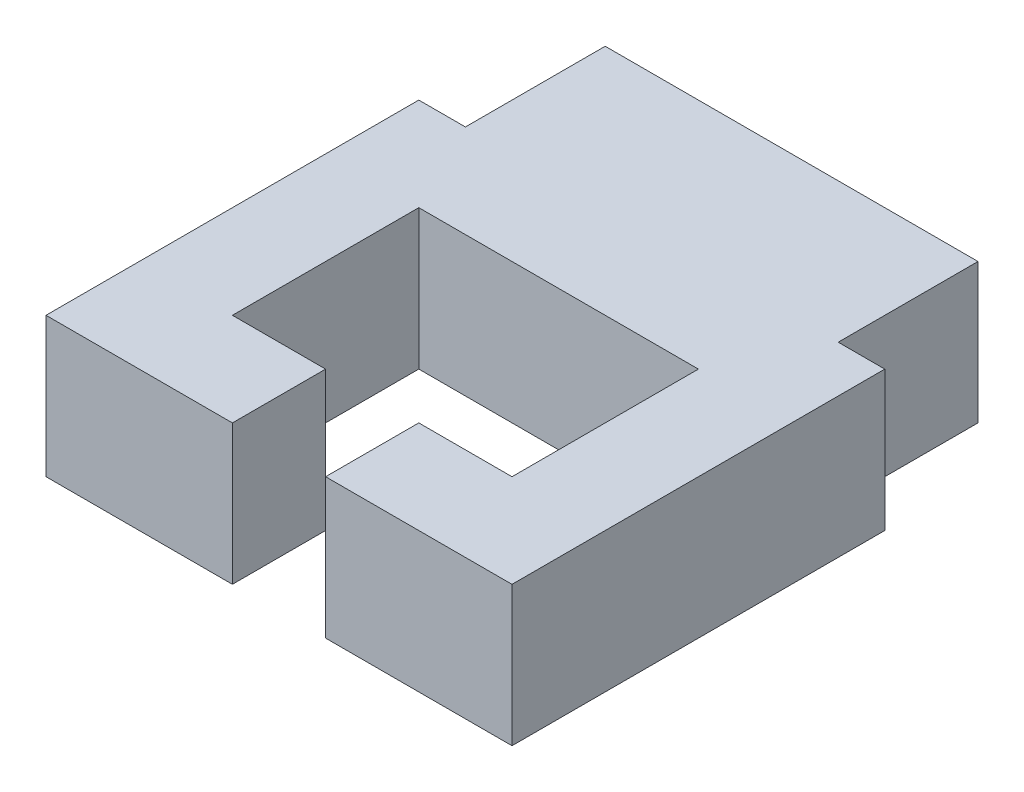
ISO-10303-21;
HEADER;
FILE_DESCRIPTION(('STEP AP214'),'2;1');
FILE_NAME('part.step','',(''),(''),'','','');
FILE_SCHEMA(('AUTOMOTIVE_DESIGN { 1 0 10303 214 1 1 1 1 }'));
ENDSEC;
DATA;
#1=APPLICATION_CONTEXT('core data for automotive mechanical design processes');
#2=APPLICATION_PROTOCOL_DEFINITION('international standard','automotive_design',2000,#1);
#3=PRODUCT_CONTEXT('',#1,'mechanical');
#4=PRODUCT('Part','Part','',(#3));
#5=PRODUCT_RELATED_PRODUCT_CATEGORY('part','',(#4));
#6=PRODUCT_DEFINITION_FORMATION('','',#4);
#7=PRODUCT_DEFINITION_CONTEXT('part definition',#1,'design');
#8=PRODUCT_DEFINITION('design','',#6,#7);
#9=PRODUCT_DEFINITION_SHAPE('','',#8);
#10=(LENGTH_UNIT() NAMED_UNIT(*) SI_UNIT(.MILLI.,.METRE.));
#11=(NAMED_UNIT(*) PLANE_ANGLE_UNIT() SI_UNIT($,.RADIAN.));
#12=(NAMED_UNIT(*) SI_UNIT($,.STERADIAN.) SOLID_ANGLE_UNIT());
#13=UNCERTAINTY_MEASURE_WITH_UNIT(LENGTH_MEASURE(1.E-05),#10,'distance_accuracy_value','');
#14=(GEOMETRIC_REPRESENTATION_CONTEXT(3) GLOBAL_UNCERTAINTY_ASSIGNED_CONTEXT((#13)) GLOBAL_UNIT_ASSIGNED_CONTEXT((#10,
#11,#12)) REPRESENTATION_CONTEXT('',''));
#15=CARTESIAN_POINT('',(0.,0.,0.));
#16=DIRECTION('',(0.,0.,1.));
#17=DIRECTION('',(1.,0.,0.));
#18=AXIS2_PLACEMENT_3D('',#15,#16,#17);
#19=CARTESIAN_POINT('',(-109.42360649,37.2151938321933,8.));
#20=DIRECTION('',(1.,0.,0.));
#21=DIRECTION('',(0.,0.,-1.));
#22=AXIS2_PLACEMENT_3D('',#19,#20,#21);
#23=PLANE('',#22);
#24=DIRECTION('',(0.,-1.,0.));
#25=VECTOR('',#24,1.);
#26=CARTESIAN_POINT('',(-109.42360649,37.2151938321933,6.));
#27=LINE('',#26,#25);
#28=CARTESIAN_POINT('',(-109.42360649,37.2151938321933,6.));
#29=VERTEX_POINT('',#28);
#30=CARTESIAN_POINT('',(-109.42360649,34.2151938321933,6.));
#31=VERTEX_POINT('',#30);
#32=EDGE_CURVE('E177',#29,#31,#27,.T.);
#33=ORIENTED_EDGE('',*,*,#32,.F.);
#34=DIRECTION('',(0.,0.,-1.));
#35=VECTOR('',#34,1.);
#36=CARTESIAN_POINT('',(-109.42360649,37.2151938321933,8.));
#37=LINE('',#36,#35);
#38=CARTESIAN_POINT('',(-109.42360649,37.2151938321933,2.));
#39=VERTEX_POINT('',#38);
#40=EDGE_CURVE('E222',#29,#39,#37,.T.);
#41=ORIENTED_EDGE('',*,*,#40,.T.);
#42=DIRECTION('',(0.,-1.,0.));
#43=VECTOR('',#42,1.);
#44=CARTESIAN_POINT('',(-109.42360649,37.2151938321933,2.));
#45=LINE('',#44,#43);
#46=CARTESIAN_POINT('',(-109.42360649,34.2151938321933,2.));
#47=VERTEX_POINT('',#46);
#48=EDGE_CURVE('E215',#39,#47,#45,.T.);
#49=ORIENTED_EDGE('',*,*,#48,.T.);
#50=DIRECTION('',(0.,0.,-1.));
#51=VECTOR('',#50,1.);
#52=CARTESIAN_POINT('',(-109.42360649,34.2151938321933,8.));
#53=LINE('',#52,#51);
#54=EDGE_CURVE('E218',#31,#47,#53,.T.);
#55=ORIENTED_EDGE('',*,*,#54,.F.);
#56=EDGE_LOOP('',(#33,#41,#49,#55));
#57=FACE_BOUND('',#56,.T.);
#58=ADVANCED_FACE('F34',(#57),#23,.F.);
#59=CARTESIAN_POINT('',(-115.42360649,37.2151938321933,8.));
#60=DIRECTION('',(-1.,0.,0.));
#61=DIRECTION('',(0.,0.,1.));
#62=AXIS2_PLACEMENT_3D('',#59,#60,#61);
#63=PLANE('',#62);
#64=DIRECTION('',(0.,1.,0.));
#65=VECTOR('',#64,1.);
#66=CARTESIAN_POINT('',(-115.42360649,37.2151938321933,6.));
#67=LINE('',#66,#65);
#68=CARTESIAN_POINT('',(-115.42360649,34.2151938321933,6.));
#69=VERTEX_POINT('',#68);
#70=CARTESIAN_POINT('',(-115.42360649,37.2151938321933,6.));
#71=VERTEX_POINT('',#70);
#72=EDGE_CURVE('E187',#69,#71,#67,.T.);
#73=ORIENTED_EDGE('',*,*,#72,.F.);
#74=DIRECTION('',(0.,0.,-1.));
#75=VECTOR('',#74,1.);
#76=CARTESIAN_POINT('',(-115.42360649,34.2151938321933,8.));
#77=LINE('',#76,#75);
#78=CARTESIAN_POINT('',(-115.42360649,34.2151938321933,2.));
#79=VERTEX_POINT('',#78);
#80=EDGE_CURVE('E49',#69,#79,#77,.T.);
#81=ORIENTED_EDGE('',*,*,#80,.T.);
#82=DIRECTION('',(0.,1.,0.));
#83=VECTOR('',#82,1.);
#84=CARTESIAN_POINT('',(-115.42360649,37.2151938321933,2.));
#85=LINE('',#84,#83);
#86=CARTESIAN_POINT('',(-115.42360649,37.2151938321933,2.));
#87=VERTEX_POINT('',#86);
#88=EDGE_CURVE('E203',#79,#87,#85,.T.);
#89=ORIENTED_EDGE('',*,*,#88,.T.);
#90=DIRECTION('',(0.,0.,-1.));
#91=VECTOR('',#90,1.);
#92=CARTESIAN_POINT('',(-115.42360649,37.2151938321933,8.));
#93=LINE('',#92,#91);
#94=EDGE_CURVE('E57',#71,#87,#93,.T.);
#95=ORIENTED_EDGE('',*,*,#94,.F.);
#96=EDGE_LOOP('',(#73,#81,#89,#95));
#97=FACE_BOUND('',#96,.T.);
#98=ADVANCED_FACE('F312',(#97),#63,.F.);
#99=CARTESIAN_POINT('',(0.,0.,2.));
#100=DIRECTION('',(0.,0.,1.));
#101=DIRECTION('',(1.,0.,0.));
#102=AXIS2_PLACEMENT_3D('',#99,#100,#101);
#103=PLANE('',#102);
#104=DIRECTION('',(-1.,0.,0.));
#105=VECTOR('',#104,1.);
#106=CARTESIAN_POINT('',(-117.42360649,37.2151938321933,2.));
#107=LINE('',#106,#105);
#108=EDGE_CURVE('E252',#39,#87,#107,.T.);
#109=ORIENTED_EDGE('',*,*,#108,.T.);
#110=ORIENTED_EDGE('',*,*,#88,.F.);
#111=DIRECTION('',(1.,0.,0.));
#112=VECTOR('',#111,1.);
#113=CARTESIAN_POINT('',(-117.42360649,34.2151938321933,2.));
#114=LINE('',#113,#112);
#115=EDGE_CURVE('E249',#79,#47,#114,.T.);
#116=ORIENTED_EDGE('',*,*,#115,.T.);
#117=ORIENTED_EDGE('',*,*,#48,.F.);
#118=EDGE_LOOP('',(#109,#110,#116,#117));
#119=FACE_BOUND('',#118,.T.);
#120=ADVANCED_FACE('F315',(#119),#103,.T.);
#121=CARTESIAN_POINT('',(0.,0.,0.));
#122=DIRECTION('',(0.,0.,1.));
#123=DIRECTION('',(1.,0.,0.));
#124=AXIS2_PLACEMENT_3D('',#121,#122,#123);
#125=PLANE('',#124);
#126=DIRECTION('',(-1.,0.,0.));
#127=VECTOR('',#126,1.);
#128=CARTESIAN_POINT('',(-117.42360649,37.2151938321933,0.));
#129=LINE('',#128,#127);
#130=CARTESIAN_POINT('',(-116.423606490072,37.2151938321933,0.));
#131=VERTEX_POINT('',#130);
#132=CARTESIAN_POINT('',(-117.42360649,37.2151938321933,0.));
#133=VERTEX_POINT('',#132);
#134=EDGE_CURVE('E264',#131,#133,#129,.T.);
#135=ORIENTED_EDGE('',*,*,#134,.F.);
#136=DIRECTION('',(0.,-1.,0.));
#137=VECTOR('',#136,1.);
#138=CARTESIAN_POINT('',(-116.423606490072,0.,0.));
#139=LINE('',#138,#137);
#140=CARTESIAN_POINT('',(-116.423606490072,34.2151938321933,0.));
#141=VERTEX_POINT('',#140);
#142=EDGE_CURVE('E228',#131,#141,#139,.T.);
#143=ORIENTED_EDGE('',*,*,#142,.T.);
#144=DIRECTION('',(1.,0.,0.));
#145=VECTOR('',#144,1.);
#146=CARTESIAN_POINT('',(-117.42360649,34.2151938321933,0.));
#147=LINE('',#146,#145);
#148=CARTESIAN_POINT('',(-117.42360649,34.2151938321933,0.));
#149=VERTEX_POINT('',#148);
#150=EDGE_CURVE('E259',#149,#141,#147,.T.);
#151=ORIENTED_EDGE('',*,*,#150,.F.);
#152=DIRECTION('',(0.,-1.,0.));
#153=VECTOR('',#152,1.);
#154=CARTESIAN_POINT('',(-117.42360649,37.2151938321933,0.));
#155=LINE('',#154,#153);
#156=EDGE_CURVE('E248',#133,#149,#155,.T.);
#157=ORIENTED_EDGE('',*,*,#156,.F.);
#158=EDGE_LOOP('',(#135,#143,#151,#157));
#159=FACE_BOUND('',#158,.T.);
#160=ADVANCED_FACE('F297',(#159),#125,.F.);
#161=CARTESIAN_POINT('',(-117.42360649,37.2151938321933,2.));
#162=DIRECTION('',(1.,0.,0.));
#163=DIRECTION('',(0.,0.,-1.));
#164=AXIS2_PLACEMENT_3D('',#161,#162,#163);
#165=PLANE('',#164);
#166=ORIENTED_EDGE('',*,*,#156,.T.);
#167=DIRECTION('',(0.,0.,-1.));
#168=VECTOR('',#167,1.);
#169=CARTESIAN_POINT('',(-117.42360649,34.2151938321933,2.));
#170=LINE('',#169,#168);
#171=CARTESIAN_POINT('',(-117.42360649,34.2151938321933,8.));
#172=VERTEX_POINT('',#171);
#173=EDGE_CURVE('E11',#172,#149,#170,.T.);
#174=ORIENTED_EDGE('',*,*,#173,.F.);
#175=DIRECTION('',(0.,-1.,0.));
#176=VECTOR('',#175,1.);
#177=CARTESIAN_POINT('',(-117.42360649,34.2151938321933,8.));
#178=LINE('',#177,#176);
#179=CARTESIAN_POINT('',(-117.42360649,37.2151938321933,8.));
#180=VERTEX_POINT('',#179);
#181=EDGE_CURVE('E204',#180,#172,#178,.T.);
#182=ORIENTED_EDGE('',*,*,#181,.F.);
#183=DIRECTION('',(0.,0.,-1.));
#184=VECTOR('',#183,1.);
#185=CARTESIAN_POINT('',(-117.42360649,37.2151938321933,2.));
#186=LINE('',#185,#184);
#187=EDGE_CURVE('E255',#180,#133,#186,.T.);
#188=ORIENTED_EDGE('',*,*,#187,.T.);
#189=EDGE_LOOP('',(#166,#174,#182,#188));
#190=FACE_BOUND('',#189,.T.);
#191=ADVANCED_FACE('F36',(#190),#165,.F.);
#192=CARTESIAN_POINT('',(-117.42360649,34.2151938321933,2.));
#193=DIRECTION('',(0.,1.,0.));
#194=DIRECTION('',(0.,0.,1.));
#195=AXIS2_PLACEMENT_3D('',#192,#193,#194);
#196=PLANE('',#195);
#197=ORIENTED_EDGE('',*,*,#150,.T.);
#198=DIRECTION('',(0.,0.,1.));
#199=VECTOR('',#198,1.);
#200=CARTESIAN_POINT('',(-116.423606490072,34.2151938321933,-3.));
#201=LINE('',#200,#199);
#202=CARTESIAN_POINT('',(-116.423606490072,34.2151938321933,-3.));
#203=VERTEX_POINT('',#202);
#204=EDGE_CURVE('E242',#203,#141,#201,.T.);
#205=ORIENTED_EDGE('',*,*,#204,.F.);
#206=DIRECTION('',(-1.,0.,0.));
#207=VECTOR('',#206,1.);
#208=CARTESIAN_POINT('',(0.,34.2151938321933,-3.));
#209=LINE('',#208,#207);
#210=CARTESIAN_POINT('',(-108.423606490072,34.2151938321933,-3.));
#211=VERTEX_POINT('',#210);
#212=EDGE_CURVE('E231',#211,#203,#209,.T.);
#213=ORIENTED_EDGE('',*,*,#212,.F.);
#214=DIRECTION('',(0.,0.,1.));
#215=VECTOR('',#214,1.);
#216=CARTESIAN_POINT('',(-108.423606490072,34.2151938321933,-3.));
#217=LINE('',#216,#215);
#218=CARTESIAN_POINT('',(-108.423606490072,34.2151938321933,0.));
#219=VERTEX_POINT('',#218);
#220=EDGE_CURVE('E244',#211,#219,#217,.T.);
#221=ORIENTED_EDGE('',*,*,#220,.T.);
#222=CARTESIAN_POINT('',(-107.42360649,34.2151938321933,0.));
#223=VERTEX_POINT('',#222);
#224=EDGE_CURVE('E258',#219,#223,#147,.T.);
#225=ORIENTED_EDGE('',*,*,#224,.T.);
#226=DIRECTION('',(0.,0.,-1.));
#227=VECTOR('',#226,1.);
#228=CARTESIAN_POINT('',(-107.42360649,34.2151938321933,2.));
#229=LINE('',#228,#227);
#230=CARTESIAN_POINT('',(-107.42360649,34.2151938321933,8.));
#231=VERTEX_POINT('',#230);
#232=EDGE_CURVE('E42',#231,#223,#229,.T.);
#233=ORIENTED_EDGE('',*,*,#232,.F.);
#234=DIRECTION('',(1.,0.,0.));
#235=VECTOR('',#234,1.);
#236=CARTESIAN_POINT('',(-109.42360649,34.2151938321933,8.));
#237=LINE('',#236,#235);
#238=CARTESIAN_POINT('',(-111.42360649,34.2151938321933,8.));
#239=VERTEX_POINT('',#238);
#240=EDGE_CURVE('E161',#239,#231,#237,.T.);
#241=ORIENTED_EDGE('',*,*,#240,.F.);
#242=DIRECTION('',(0.,0.,1.));
#243=VECTOR('',#242,1.);
#244=CARTESIAN_POINT('',(-111.42360649,34.2151938321933,8.));
#245=LINE('',#244,#243);
#246=CARTESIAN_POINT('',(-111.42360649,34.2151938321933,6.));
#247=VERTEX_POINT('',#246);
#248=EDGE_CURVE('E176',#247,#239,#245,.T.);
#249=ORIENTED_EDGE('',*,*,#248,.F.);
#250=DIRECTION('',(1.,0.,0.));
#251=VECTOR('',#250,1.);
#252=CARTESIAN_POINT('',(-111.42360649,34.2151938321933,6.));
#253=LINE('',#252,#251);
#254=EDGE_CURVE('E182',#247,#31,#253,.T.);
#255=ORIENTED_EDGE('',*,*,#254,.T.);
#256=ORIENTED_EDGE('',*,*,#54,.T.);
#257=ORIENTED_EDGE('',*,*,#115,.F.);
#258=ORIENTED_EDGE('',*,*,#80,.F.);
#259=DIRECTION('',(-1.,0.,0.));
#260=VECTOR('',#259,1.);
#261=CARTESIAN_POINT('',(-113.42360649,34.2151938321933,6.));
#262=LINE('',#261,#260);
#263=CARTESIAN_POINT('',(-113.42360649,34.2151938321933,6.));
#264=VERTEX_POINT('',#263);
#265=EDGE_CURVE('E201',#264,#69,#262,.T.);
#266=ORIENTED_EDGE('',*,*,#265,.F.);
#267=DIRECTION('',(0.,0.,-1.));
#268=VECTOR('',#267,1.);
#269=CARTESIAN_POINT('',(-113.42360649,34.2151938321933,6.));
#270=LINE('',#269,#268);
#271=CARTESIAN_POINT('',(-113.42360649,34.2151938321933,8.));
#272=VERTEX_POINT('',#271);
#273=EDGE_CURVE('E191',#272,#264,#270,.T.);
#274=ORIENTED_EDGE('',*,*,#273,.F.);
#275=DIRECTION('',(1.,0.,0.));
#276=VECTOR('',#275,1.);
#277=CARTESIAN_POINT('',(-115.42360649,34.2151938321933,8.));
#278=LINE('',#277,#276);
#279=EDGE_CURVE('E207',#172,#272,#278,.T.);
#280=ORIENTED_EDGE('',*,*,#279,.F.);
#281=ORIENTED_EDGE('',*,*,#173,.T.);
#282=EDGE_LOOP('',(#197,#205,#213,#221,#225,#233,#241,#249,#255,#256,#257,#258,#266,#274,#280,#281));
#283=FACE_BOUND('',#282,.T.);
#284=ADVANCED_FACE('F299',(#283),#196,.F.);
#285=CARTESIAN_POINT('',(-107.42360649,37.2151938321933,2.));
#286=DIRECTION('',(-1.,0.,0.));
#287=DIRECTION('',(0.,0.,1.));
#288=AXIS2_PLACEMENT_3D('',#285,#286,#287);
#289=PLANE('',#288);
#290=DIRECTION('',(0.,1.,0.));
#291=VECTOR('',#290,1.);
#292=CARTESIAN_POINT('',(-107.42360649,37.2151938321933,0.));
#293=LINE('',#292,#291);
#294=CARTESIAN_POINT('',(-107.42360649,37.2151938321933,0.));
#295=VERTEX_POINT('',#294);
#296=EDGE_CURVE('E262',#223,#295,#293,.T.);
#297=ORIENTED_EDGE('',*,*,#296,.T.);
#298=DIRECTION('',(0.,0.,-1.));
#299=VECTOR('',#298,1.);
#300=CARTESIAN_POINT('',(-107.42360649,37.2151938321933,2.));
#301=LINE('',#300,#299);
#302=CARTESIAN_POINT('',(-107.42360649,37.2151938321933,8.));
#303=VERTEX_POINT('',#302);
#304=EDGE_CURVE('E268',#303,#295,#301,.T.);
#305=ORIENTED_EDGE('',*,*,#304,.F.);
#306=DIRECTION('',(0.,1.,0.));
#307=VECTOR('',#306,1.);
#308=CARTESIAN_POINT('',(-107.42360649,34.2151938321933,8.));
#309=LINE('',#308,#307);
#310=EDGE_CURVE('E159',#231,#303,#309,.T.);
#311=ORIENTED_EDGE('',*,*,#310,.F.);
#312=ORIENTED_EDGE('',*,*,#232,.T.);
#313=EDGE_LOOP('',(#297,#305,#311,#312));
#314=FACE_BOUND('',#313,.T.);
#315=ADVANCED_FACE('F272',(#314),#289,.F.);
#316=CARTESIAN_POINT('',(-117.42360649,37.2151938321933,2.));
#317=DIRECTION('',(0.,-1.,0.));
#318=DIRECTION('',(0.,0.,-1.));
#319=AXIS2_PLACEMENT_3D('',#316,#317,#318);
#320=PLANE('',#319);
#321=CARTESIAN_POINT('',(-108.423606490072,37.2151938321933,0.));
#322=VERTEX_POINT('',#321);
#323=EDGE_CURVE('E253',#295,#322,#129,.T.);
#324=ORIENTED_EDGE('',*,*,#323,.T.);
#325=DIRECTION('',(0.,0.,1.));
#326=VECTOR('',#325,1.);
#327=CARTESIAN_POINT('',(-108.423606490072,37.2151938321933,-3.));
#328=LINE('',#327,#326);
#329=CARTESIAN_POINT('',(-108.423606490072,37.2151938321933,-3.));
#330=VERTEX_POINT('',#329);
#331=EDGE_CURVE('E246',#330,#322,#328,.T.);
#332=ORIENTED_EDGE('',*,*,#331,.F.);
#333=DIRECTION('',(1.,0.,0.));
#334=VECTOR('',#333,1.);
#335=CARTESIAN_POINT('',(0.,37.2151938321933,-3.));
#336=LINE('',#335,#334);
#337=CARTESIAN_POINT('',(-116.423606490072,37.2151938321933,-3.));
#338=VERTEX_POINT('',#337);
#339=EDGE_CURVE('E225',#338,#330,#336,.T.);
#340=ORIENTED_EDGE('',*,*,#339,.F.);
#341=DIRECTION('',(0.,0.,1.));
#342=VECTOR('',#341,1.);
#343=CARTESIAN_POINT('',(-116.423606490072,37.2151938321933,-3.));
#344=LINE('',#343,#342);
#345=EDGE_CURVE('E236',#338,#131,#344,.T.);
#346=ORIENTED_EDGE('',*,*,#345,.T.);
#347=ORIENTED_EDGE('',*,*,#134,.T.);
#348=ORIENTED_EDGE('',*,*,#187,.F.);
#349=DIRECTION('',(-1.,0.,0.));
#350=VECTOR('',#349,1.);
#351=CARTESIAN_POINT('',(-117.42360649,37.2151938321933,8.));
#352=LINE('',#351,#350);
#353=CARTESIAN_POINT('',(-113.42360649,37.2151938321933,8.));
#354=VERTEX_POINT('',#353);
#355=EDGE_CURVE('E209',#354,#180,#352,.T.);
#356=ORIENTED_EDGE('',*,*,#355,.F.);
#357=DIRECTION('',(0.,0.,1.));
#358=VECTOR('',#357,1.);
#359=CARTESIAN_POINT('',(-113.42360649,37.2151938321933,8.));
#360=LINE('',#359,#358);
#361=CARTESIAN_POINT('',(-113.42360649,37.2151938321933,6.));
#362=VERTEX_POINT('',#361);
#363=EDGE_CURVE('E195',#362,#354,#360,.T.);
#364=ORIENTED_EDGE('',*,*,#363,.F.);
#365=DIRECTION('',(-1.,0.,0.));
#366=VECTOR('',#365,1.);
#367=CARTESIAN_POINT('',(-113.42360649,37.2151938321933,6.));
#368=LINE('',#367,#366);
#369=EDGE_CURVE('E198',#362,#71,#368,.T.);
#370=ORIENTED_EDGE('',*,*,#369,.T.);
#371=ORIENTED_EDGE('',*,*,#94,.T.);
#372=ORIENTED_EDGE('',*,*,#108,.F.);
#373=ORIENTED_EDGE('',*,*,#40,.F.);
#374=DIRECTION('',(1.,0.,0.));
#375=VECTOR('',#374,1.);
#376=CARTESIAN_POINT('',(-111.42360649,37.2151938321933,6.));
#377=LINE('',#376,#375);
#378=CARTESIAN_POINT('',(-111.42360649,37.2151938321933,6.));
#379=VERTEX_POINT('',#378);
#380=EDGE_CURVE('E168',#379,#29,#377,.T.);
#381=ORIENTED_EDGE('',*,*,#380,.F.);
#382=DIRECTION('',(0.,0.,-1.));
#383=VECTOR('',#382,1.);
#384=CARTESIAN_POINT('',(-111.42360649,37.2151938321933,8.));
#385=LINE('',#384,#383);
#386=CARTESIAN_POINT('',(-111.42360649,37.2151938321933,8.));
#387=VERTEX_POINT('',#386);
#388=EDGE_CURVE('E164',#387,#379,#385,.T.);
#389=ORIENTED_EDGE('',*,*,#388,.F.);
#390=DIRECTION('',(-1.,0.,0.));
#391=VECTOR('',#390,1.);
#392=CARTESIAN_POINT('',(-107.42360649,37.2151938321933,8.));
#393=LINE('',#392,#391);
#394=EDGE_CURVE('E152',#303,#387,#393,.T.);
#395=ORIENTED_EDGE('',*,*,#394,.F.);
#396=ORIENTED_EDGE('',*,*,#304,.T.);
#397=EDGE_LOOP('',(#324,#332,#340,#346,#347,#348,#356,#364,#370,#371,#372,#373,#381,#389,#395,#396));
#398=FACE_BOUND('',#397,.T.);
#399=ADVANCED_FACE('F166',(#398),#320,.F.);
#400=ORIENTED_EDGE('',*,*,#224,.F.);
#401=DIRECTION('',(0.,1.,0.));
#402=VECTOR('',#401,1.);
#403=CARTESIAN_POINT('',(-108.423606490072,0.,0.));
#404=LINE('',#403,#402);
#405=EDGE_CURVE('E224',#219,#322,#404,.T.);
#406=ORIENTED_EDGE('',*,*,#405,.T.);
#407=ORIENTED_EDGE('',*,*,#323,.F.);
#408=ORIENTED_EDGE('',*,*,#296,.F.);
#409=EDGE_LOOP('',(#400,#406,#407,#408));
#410=FACE_BOUND('',#409,.T.);
#411=ADVANCED_FACE('F277',(#410),#125,.F.);
#412=CARTESIAN_POINT('',(-108.423606490072,0.,-3.));
#413=DIRECTION('',(1.,0.,0.));
#414=DIRECTION('',(0.,0.,-1.));
#415=AXIS2_PLACEMENT_3D('',#412,#413,#414);
#416=PLANE('',#415);
#417=ORIENTED_EDGE('',*,*,#405,.F.);
#418=ORIENTED_EDGE('',*,*,#220,.F.);
#419=DIRECTION('',(0.,1.,0.));
#420=VECTOR('',#419,1.);
#421=CARTESIAN_POINT('',(-108.423606490072,0.,-3.));
#422=LINE('',#421,#420);
#423=EDGE_CURVE('E227',#211,#330,#422,.T.);
#424=ORIENTED_EDGE('',*,*,#423,.T.);
#425=ORIENTED_EDGE('',*,*,#331,.T.);
#426=EDGE_LOOP('',(#417,#418,#424,#425));
#427=FACE_BOUND('',#426,.T.);
#428=ADVANCED_FACE('F284',(#427),#416,.T.);
#429=CARTESIAN_POINT('',(-116.423606490072,0.,-3.));
#430=DIRECTION('',(-1.,0.,0.));
#431=DIRECTION('',(0.,0.,1.));
#432=AXIS2_PLACEMENT_3D('',#429,#430,#431);
#433=PLANE('',#432);
#434=ORIENTED_EDGE('',*,*,#142,.F.);
#435=ORIENTED_EDGE('',*,*,#345,.F.);
#436=DIRECTION('',(0.,-1.,0.));
#437=VECTOR('',#436,1.);
#438=CARTESIAN_POINT('',(-116.423606490072,0.,-3.));
#439=LINE('',#438,#437);
#440=EDGE_CURVE('E233',#338,#203,#439,.T.);
#441=ORIENTED_EDGE('',*,*,#440,.T.);
#442=ORIENTED_EDGE('',*,*,#204,.T.);
#443=EDGE_LOOP('',(#434,#435,#441,#442));
#444=FACE_BOUND('',#443,.T.);
#445=ADVANCED_FACE('F291',(#444),#433,.T.);
#446=CARTESIAN_POINT('',(0.,0.,-3.));
#447=DIRECTION('',(0.,0.,-1.));
#448=DIRECTION('',(-1.,0.,0.));
#449=AXIS2_PLACEMENT_3D('',#446,#447,#448);
#450=PLANE('',#449);
#451=ORIENTED_EDGE('',*,*,#339,.T.);
#452=ORIENTED_EDGE('',*,*,#423,.F.);
#453=ORIENTED_EDGE('',*,*,#212,.T.);
#454=ORIENTED_EDGE('',*,*,#440,.F.);
#455=EDGE_LOOP('',(#451,#452,#453,#454));
#456=FACE_BOUND('',#455,.T.);
#457=ADVANCED_FACE('F287',(#456),#450,.T.);
#458=CARTESIAN_POINT('',(0.,0.,8.));
#459=DIRECTION('',(0.,0.,1.));
#460=DIRECTION('',(1.,0.,0.));
#461=AXIS2_PLACEMENT_3D('',#458,#459,#460);
#462=PLANE('',#461);
#463=ORIENTED_EDGE('',*,*,#310,.T.);
#464=ORIENTED_EDGE('',*,*,#394,.T.);
#465=DIRECTION('',(0.,1.,0.));
#466=VECTOR('',#465,1.);
#467=CARTESIAN_POINT('',(-111.42360649,37.2151938321933,8.));
#468=LINE('',#467,#466);
#469=EDGE_CURVE('E157',#239,#387,#468,.T.);
#470=ORIENTED_EDGE('',*,*,#469,.F.);
#471=ORIENTED_EDGE('',*,*,#240,.T.);
#472=EDGE_LOOP('',(#463,#464,#470,#471));
#473=FACE_BOUND('',#472,.T.);
#474=ADVANCED_FACE('F154',(#473),#462,.T.);
#475=CARTESIAN_POINT('',(0.,0.,8.));
#476=DIRECTION('',(0.,0.,-1.));
#477=DIRECTION('',(-1.,0.,0.));
#478=AXIS2_PLACEMENT_3D('',#475,#476,#477);
#479=PLANE('',#478);
#480=ORIENTED_EDGE('',*,*,#181,.T.);
#481=ORIENTED_EDGE('',*,*,#279,.T.);
#482=DIRECTION('',(0.,-1.,0.));
#483=VECTOR('',#482,1.);
#484=CARTESIAN_POINT('',(-113.42360649,34.2151938321933,8.));
#485=LINE('',#484,#483);
#486=EDGE_CURVE('E188',#354,#272,#485,.T.);
#487=ORIENTED_EDGE('',*,*,#486,.F.);
#488=ORIENTED_EDGE('',*,*,#355,.T.);
#489=EDGE_LOOP('',(#480,#481,#487,#488));
#490=FACE_BOUND('',#489,.T.);
#491=ADVANCED_FACE('F304',(#490),#479,.F.);
#492=CARTESIAN_POINT('',(-113.42360649,37.2151938321933,6.));
#493=DIRECTION('',(0.,0.,1.));
#494=DIRECTION('',(1.,0.,0.));
#495=AXIS2_PLACEMENT_3D('',#492,#493,#494);
#496=PLANE('',#495);
#497=ORIENTED_EDGE('',*,*,#72,.T.);
#498=ORIENTED_EDGE('',*,*,#369,.F.);
#499=DIRECTION('',(0.,1.,0.));
#500=VECTOR('',#499,1.);
#501=CARTESIAN_POINT('',(-113.42360649,37.2151938321933,6.));
#502=LINE('',#501,#500);
#503=EDGE_CURVE('E193',#264,#362,#502,.T.);
#504=ORIENTED_EDGE('',*,*,#503,.F.);
#505=ORIENTED_EDGE('',*,*,#265,.T.);
#506=EDGE_LOOP('',(#497,#498,#504,#505));
#507=FACE_BOUND('',#506,.T.);
#508=ADVANCED_FACE('F311',(#507),#496,.F.);
#509=CARTESIAN_POINT('',(-113.42360649,0.,0.));
#510=DIRECTION('',(-1.,0.,0.));
#511=DIRECTION('',(0.,0.,1.));
#512=AXIS2_PLACEMENT_3D('',#509,#510,#511);
#513=PLANE('',#512);
#514=ORIENTED_EDGE('',*,*,#486,.T.);
#515=ORIENTED_EDGE('',*,*,#273,.T.);
#516=ORIENTED_EDGE('',*,*,#503,.T.);
#517=ORIENTED_EDGE('',*,*,#363,.T.);
#518=EDGE_LOOP('',(#514,#515,#516,#517));
#519=FACE_BOUND('',#518,.T.);
#520=ADVANCED_FACE('F307',(#519),#513,.F.);
#521=CARTESIAN_POINT('',(-111.42360649,37.2151938321933,6.));
#522=DIRECTION('',(0.,0.,1.));
#523=DIRECTION('',(1.,0.,0.));
#524=AXIS2_PLACEMENT_3D('',#521,#522,#523);
#525=PLANE('',#524);
#526=ORIENTED_EDGE('',*,*,#32,.T.);
#527=ORIENTED_EDGE('',*,*,#254,.F.);
#528=DIRECTION('',(0.,-1.,0.));
#529=VECTOR('',#528,1.);
#530=CARTESIAN_POINT('',(-111.42360649,37.2151938321933,6.));
#531=LINE('',#530,#529);
#532=EDGE_CURVE('E171',#379,#247,#531,.T.);
#533=ORIENTED_EDGE('',*,*,#532,.F.);
#534=ORIENTED_EDGE('',*,*,#380,.T.);
#535=EDGE_LOOP('',(#526,#527,#533,#534));
#536=FACE_BOUND('',#535,.T.);
#537=ADVANCED_FACE('F322',(#536),#525,.F.);
#538=CARTESIAN_POINT('',(-111.42360649,0.,0.));
#539=DIRECTION('',(1.,0.,0.));
#540=DIRECTION('',(0.,0.,-1.));
#541=AXIS2_PLACEMENT_3D('',#538,#539,#540);
#542=PLANE('',#541);
#543=ORIENTED_EDGE('',*,*,#469,.T.);
#544=ORIENTED_EDGE('',*,*,#388,.T.);
#545=ORIENTED_EDGE('',*,*,#532,.T.);
#546=ORIENTED_EDGE('',*,*,#248,.T.);
#547=EDGE_LOOP('',(#543,#544,#545,#546));
#548=FACE_BOUND('',#547,.T.);
#549=ADVANCED_FACE('F174',(#548),#542,.F.);
#550=CLOSED_SHELL('',(#58,#98,#120,#160,#191,#284,#315,#399,#411,#428,#445,#457,#474,#491,#508,
#520,#537,#549));
#551=MANIFOLD_SOLID_BREP('B2',#550);
#552=ADVANCED_BREP_SHAPE_REPRESENTATION('',(#18,#551),#14);
#553=SHAPE_DEFINITION_REPRESENTATION(#9,#552);
ENDSEC;
END-ISO-10303-21;
